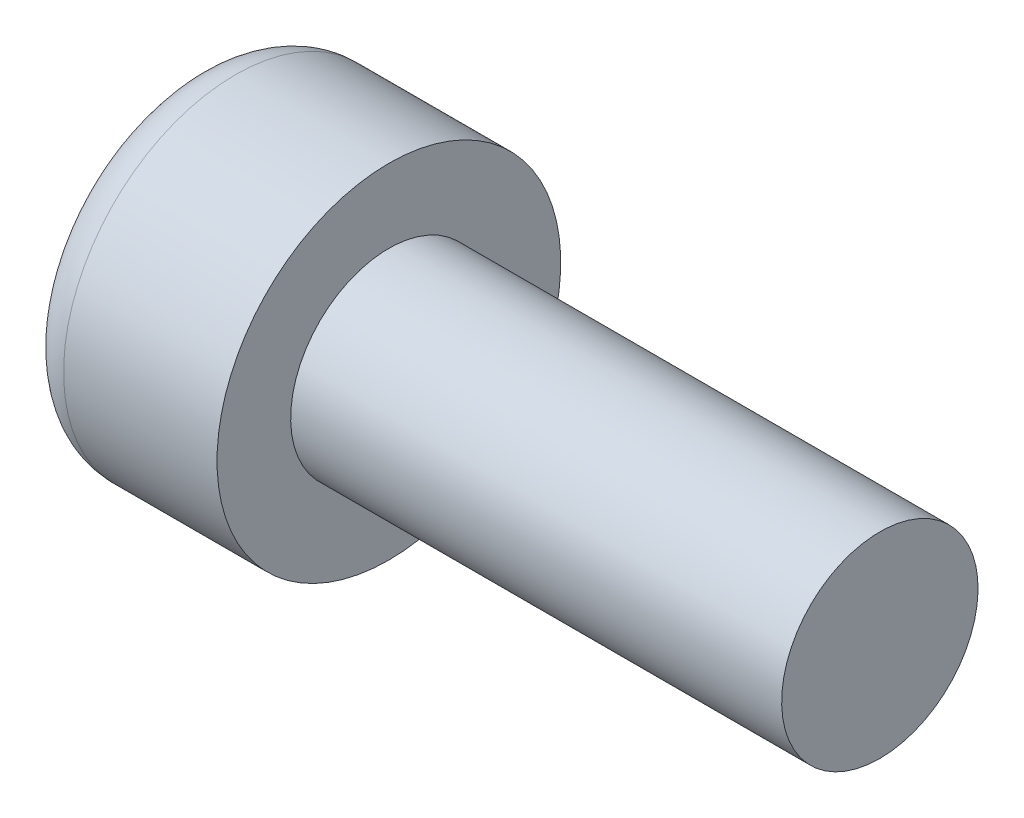
ISO-10303-21;
HEADER;
FILE_DESCRIPTION(('STEP AP214'),'2;1');
FILE_NAME('part.step','',(''),(''),'','','');
FILE_SCHEMA(('AUTOMOTIVE_DESIGN { 1 0 10303 214 1 1 1 1 }'));
ENDSEC;
DATA;
#1=APPLICATION_CONTEXT('core data for automotive mechanical design processes');
#2=APPLICATION_PROTOCOL_DEFINITION('international standard','automotive_design',2000,#1);
#3=PRODUCT_CONTEXT('',#1,'mechanical');
#4=PRODUCT('Part','Part','',(#3));
#5=PRODUCT_RELATED_PRODUCT_CATEGORY('part','',(#4));
#6=PRODUCT_DEFINITION_FORMATION('','',#4);
#7=PRODUCT_DEFINITION_CONTEXT('part definition',#1,'design');
#8=PRODUCT_DEFINITION('design','',#6,#7);
#9=PRODUCT_DEFINITION_SHAPE('','',#8);
#10=(LENGTH_UNIT() NAMED_UNIT(*) SI_UNIT(.MILLI.,.METRE.));
#11=(NAMED_UNIT(*) PLANE_ANGLE_UNIT() SI_UNIT($,.RADIAN.));
#12=(NAMED_UNIT(*) SI_UNIT($,.STERADIAN.) SOLID_ANGLE_UNIT());
#13=UNCERTAINTY_MEASURE_WITH_UNIT(LENGTH_MEASURE(1.E-05),#10,'distance_accuracy_value','');
#14=(GEOMETRIC_REPRESENTATION_CONTEXT(3) GLOBAL_UNCERTAINTY_ASSIGNED_CONTEXT((#13)) GLOBAL_UNIT_ASSIGNED_CONTEXT((#10,
#11,#12)) REPRESENTATION_CONTEXT('',''));
#15=CARTESIAN_POINT('',(0.,0.,0.));
#16=DIRECTION('',(0.,0.,1.));
#17=DIRECTION('',(1.,0.,0.));
#18=AXIS2_PLACEMENT_3D('',#15,#16,#17);
#19=CARTESIAN_POINT('',(0.,0.,0.));
#20=DIRECTION('',(1.,0.,0.));
#21=DIRECTION('',(0.,1.,0.));
#22=AXIS2_PLACEMENT_3D('',#19,#20,#21);
#23=PLANE('',#22);
#24=DIRECTION('',(0.,-0.5,-0.866025403784439));
#25=VECTOR('',#24,1.);
#26=CARTESIAN_POINT('',(0.,1.73205080756888,0.));
#27=LINE('',#26,#25);
#28=CARTESIAN_POINT('',(0.,1.73205080756888,0.));
#29=VERTEX_POINT('',#28);
#30=CARTESIAN_POINT('',(0.,0.866025403784439,-1.5));
#31=VERTEX_POINT('',#30);
#32=EDGE_CURVE('E121',#29,#31,#27,.T.);
#33=ORIENTED_EDGE('',*,*,#32,.F.);
#34=DIRECTION('',(0.,0.5,-0.866025403784439));
#35=VECTOR('',#34,1.);
#36=CARTESIAN_POINT('',(0.,0.866025403784439,1.5));
#37=LINE('',#36,#35);
#38=CARTESIAN_POINT('',(0.,0.866025403784439,1.5));
#39=VERTEX_POINT('',#38);
#40=EDGE_CURVE('E47',#39,#29,#37,.T.);
#41=ORIENTED_EDGE('',*,*,#40,.F.);
#42=DIRECTION('',(0.,1.,0.));
#43=VECTOR('',#42,1.);
#44=CARTESIAN_POINT('',(0.,-0.866025403784439,1.5));
#45=LINE('',#44,#43);
#46=CARTESIAN_POINT('',(0.,-0.866025403784439,1.5));
#47=VERTEX_POINT('',#46);
#48=EDGE_CURVE('E130',#47,#39,#45,.T.);
#49=ORIENTED_EDGE('',*,*,#48,.F.);
#50=DIRECTION('',(0.,0.5,0.866025403784439));
#51=VECTOR('',#50,1.);
#52=CARTESIAN_POINT('',(0.,-1.73205080756888,0.));
#53=LINE('',#52,#51);
#54=CARTESIAN_POINT('',(0.,-1.73205080756888,0.));
#55=VERTEX_POINT('',#54);
#56=EDGE_CURVE('E128',#55,#47,#53,.T.);
#57=ORIENTED_EDGE('',*,*,#56,.F.);
#58=DIRECTION('',(0.,-0.5,0.866025403784439));
#59=VECTOR('',#58,1.);
#60=CARTESIAN_POINT('',(0.,-0.866025403784439,-1.5));
#61=LINE('',#60,#59);
#62=CARTESIAN_POINT('',(0.,-0.866025403784439,-1.5));
#63=VERTEX_POINT('',#62);
#64=EDGE_CURVE('E95',#63,#55,#61,.T.);
#65=ORIENTED_EDGE('',*,*,#64,.F.);
#66=DIRECTION('',(0.,-1.,0.));
#67=VECTOR('',#66,1.);
#68=CARTESIAN_POINT('',(0.,0.866025403784439,-1.5));
#69=LINE('',#68,#67);
#70=EDGE_CURVE('E124',#31,#63,#69,.T.);
#71=ORIENTED_EDGE('',*,*,#70,.F.);
#72=EDGE_LOOP('',(#33,#41,#49,#57,#65,#71));
#73=FACE_BOUND('',#72,.T.);
#74=CARTESIAN_POINT('',(0.,0.,0.));
#75=DIRECTION('',(-1.,0.,0.));
#76=DIRECTION('',(0.,-1.,0.));
#77=AXIS2_PLACEMENT_3D('',#74,#75,#76);
#78=CIRCLE('',#77,2.625);
#79=CARTESIAN_POINT('',(0.,-2.625,0.));
#80=VERTEX_POINT('',#79);
#81=EDGE_CURVE('E11',#80,#80,#78,.T.);
#82=ORIENTED_EDGE('',*,*,#81,.T.);
#83=EDGE_LOOP('',(#82));
#84=FACE_BOUND('',#83,.T.);
#85=ADVANCED_FACE('F33',(#73,#84),#23,.F.);
#86=CARTESIAN_POINT('',(0.875,0.,0.));
#87=DIRECTION('',(-1.,0.,0.));
#88=DIRECTION('',(0.,-1.,0.));
#89=AXIS2_PLACEMENT_3D('',#86,#87,#88);
#90=TOROIDAL_SURFACE('',#89,2.625,0.875);
#91=ORIENTED_EDGE('',*,*,#81,.F.);
#92=EDGE_LOOP('',(#91));
#93=FACE_BOUND('',#92,.T.);
#94=CARTESIAN_POINT('',(0.875,0.,0.));
#95=DIRECTION('',(-1.,0.,0.));
#96=DIRECTION('',(0.,-1.,0.));
#97=AXIS2_PLACEMENT_3D('',#94,#95,#96);
#98=CIRCLE('',#97,3.5);
#99=CARTESIAN_POINT('',(0.875000000000001,-3.5,0.));
#100=VERTEX_POINT('',#99);
#101=EDGE_CURVE('E40',#100,#100,#98,.T.);
#102=ORIENTED_EDGE('',*,*,#101,.T.);
#103=EDGE_LOOP('',(#102));
#104=FACE_BOUND('',#103,.T.);
#105=ADVANCED_FACE('F150',(#93,#104),#90,.T.);
#106=CARTESIAN_POINT('',(0.,0.,0.));
#107=DIRECTION('',(-1.,0.,0.));
#108=DIRECTION('',(0.,-1.,0.));
#109=AXIS2_PLACEMENT_3D('',#106,#107,#108);
#110=CYLINDRICAL_SURFACE('',#109,3.5);
#111=ORIENTED_EDGE('',*,*,#101,.F.);
#112=EDGE_LOOP('',(#111));
#113=FACE_BOUND('',#112,.T.);
#114=CARTESIAN_POINT('',(4.,0.,0.));
#115=DIRECTION('',(-1.,0.,0.));
#116=DIRECTION('',(0.,-1.,0.));
#117=AXIS2_PLACEMENT_3D('',#114,#115,#116);
#118=CIRCLE('',#117,3.5);
#119=CARTESIAN_POINT('',(4.,-3.5,0.));
#120=VERTEX_POINT('',#119);
#121=EDGE_CURVE('E145',#120,#120,#118,.T.);
#122=ORIENTED_EDGE('',*,*,#121,.T.);
#123=EDGE_LOOP('',(#122));
#124=FACE_BOUND('',#123,.T.);
#125=ADVANCED_FACE('F152',(#113,#124),#110,.T.);
#126=CARTESIAN_POINT('',(4.,3.5,0.));
#127=DIRECTION('',(-1.,0.,0.));
#128=DIRECTION('',(0.,-1.,0.));
#129=AXIS2_PLACEMENT_3D('',#126,#127,#128);
#130=PLANE('',#129);
#131=ORIENTED_EDGE('',*,*,#121,.F.);
#132=EDGE_LOOP('',(#131));
#133=FACE_BOUND('',#132,.T.);
#134=CARTESIAN_POINT('',(4.,0.,0.));
#135=DIRECTION('',(-1.,0.,0.));
#136=DIRECTION('',(0.,-1.,0.));
#137=AXIS2_PLACEMENT_3D('',#134,#135,#136);
#138=CIRCLE('',#137,2.);
#139=CARTESIAN_POINT('',(4.,-2.,0.));
#140=VERTEX_POINT('',#139);
#141=EDGE_CURVE('E142',#140,#140,#138,.T.);
#142=ORIENTED_EDGE('',*,*,#141,.T.);
#143=EDGE_LOOP('',(#142));
#144=FACE_BOUND('',#143,.T.);
#145=ADVANCED_FACE('F155',(#133,#144),#130,.F.);
#146=CARTESIAN_POINT('',(0.,0.,0.));
#147=DIRECTION('',(-1.,0.,0.));
#148=DIRECTION('',(0.,-1.,0.));
#149=AXIS2_PLACEMENT_3D('',#146,#147,#148);
#150=CYLINDRICAL_SURFACE('',#149,2.);
#151=ORIENTED_EDGE('',*,*,#141,.F.);
#152=EDGE_LOOP('',(#151));
#153=FACE_BOUND('',#152,.T.);
#154=CARTESIAN_POINT('',(14.,0.,0.));
#155=DIRECTION('',(-1.,0.,0.));
#156=DIRECTION('',(0.,-1.,0.));
#157=AXIS2_PLACEMENT_3D('',#154,#155,#156);
#158=CIRCLE('',#157,2.);
#159=CARTESIAN_POINT('',(14.,-1.99999999999999,0.));
#160=VERTEX_POINT('',#159);
#161=EDGE_CURVE('E134',#160,#160,#158,.T.);
#162=ORIENTED_EDGE('',*,*,#161,.T.);
#163=EDGE_LOOP('',(#162));
#164=FACE_BOUND('',#163,.T.);
#165=ADVANCED_FACE('F161',(#153,#164),#150,.T.);
#166=CARTESIAN_POINT('',(14.,2.,0.));
#167=DIRECTION('',(-1.,0.,0.));
#168=DIRECTION('',(0.,-1.,0.));
#169=AXIS2_PLACEMENT_3D('',#166,#167,#168);
#170=PLANE('',#169);
#171=ORIENTED_EDGE('',*,*,#161,.F.);
#172=EDGE_LOOP('',(#171));
#173=FACE_BOUND('',#172,.T.);
#174=ADVANCED_FACE('F167',(#173),#170,.F.);
#175=CARTESIAN_POINT('',(2.,0.866025403784439,1.5));
#176=DIRECTION('',(0.,0.866025403784439,0.5));
#177=DIRECTION('',(0.,-0.5,0.866025403784439));
#178=AXIS2_PLACEMENT_3D('',#175,#176,#177);
#179=PLANE('',#178);
#180=ORIENTED_EDGE('',*,*,#40,.T.);
#181=DIRECTION('',(-1.,0.,0.));
#182=VECTOR('',#181,1.);
#183=CARTESIAN_POINT('',(2.,1.73205080756888,0.));
#184=LINE('',#183,#182);
#185=CARTESIAN_POINT('',(2.,1.73205080756888,0.));
#186=VERTEX_POINT('',#185);
#187=EDGE_CURVE('E77',#186,#29,#184,.T.);
#188=ORIENTED_EDGE('',*,*,#187,.F.);
#189=DIRECTION('',(0.,0.5,-0.866025403784439));
#190=VECTOR('',#189,1.);
#191=CARTESIAN_POINT('',(2.,0.866025403784439,1.5));
#192=LINE('',#191,#190);
#193=CARTESIAN_POINT('',(2.,0.866025403784439,1.5));
#194=VERTEX_POINT('',#193);
#195=EDGE_CURVE('E132',#194,#186,#192,.T.);
#196=ORIENTED_EDGE('',*,*,#195,.F.);
#197=DIRECTION('',(-1.,0.,0.));
#198=VECTOR('',#197,1.);
#199=CARTESIAN_POINT('',(2.,0.866025403784439,1.5));
#200=LINE('',#199,#198);
#201=EDGE_CURVE('E55',#194,#39,#200,.T.);
#202=ORIENTED_EDGE('',*,*,#201,.T.);
#203=EDGE_LOOP('',(#180,#188,#196,#202));
#204=FACE_BOUND('',#203,.T.);
#205=ADVANCED_FACE('F172',(#204),#179,.F.);
#206=CARTESIAN_POINT('',(2.,-0.866025403784439,1.5));
#207=DIRECTION('',(0.,0.,1.));
#208=DIRECTION('',(0.,-1.,0.));
#209=AXIS2_PLACEMENT_3D('',#206,#207,#208);
#210=PLANE('',#209);
#211=ORIENTED_EDGE('',*,*,#48,.T.);
#212=ORIENTED_EDGE('',*,*,#201,.F.);
#213=DIRECTION('',(0.,1.,0.));
#214=VECTOR('',#213,1.);
#215=CARTESIAN_POINT('',(2.,-0.866025403784439,1.5));
#216=LINE('',#215,#214);
#217=CARTESIAN_POINT('',(2.,-0.866025403784439,1.5));
#218=VERTEX_POINT('',#217);
#219=EDGE_CURVE('E107',#218,#194,#216,.T.);
#220=ORIENTED_EDGE('',*,*,#219,.F.);
#221=DIRECTION('',(-1.,0.,0.));
#222=VECTOR('',#221,1.);
#223=CARTESIAN_POINT('',(2.,-0.866025403784439,1.5));
#224=LINE('',#223,#222);
#225=EDGE_CURVE('E99',#218,#47,#224,.T.);
#226=ORIENTED_EDGE('',*,*,#225,.T.);
#227=EDGE_LOOP('',(#211,#212,#220,#226));
#228=FACE_BOUND('',#227,.T.);
#229=ADVANCED_FACE('F177',(#228),#210,.F.);
#230=CARTESIAN_POINT('',(2.,-1.73205080756888,0.));
#231=DIRECTION('',(0.,-0.866025403784439,0.5));
#232=DIRECTION('',(0.,-0.5,-0.866025403784439));
#233=AXIS2_PLACEMENT_3D('',#230,#231,#232);
#234=PLANE('',#233);
#235=ORIENTED_EDGE('',*,*,#56,.T.);
#236=ORIENTED_EDGE('',*,*,#225,.F.);
#237=DIRECTION('',(0.,0.5,0.866025403784439));
#238=VECTOR('',#237,1.);
#239=CARTESIAN_POINT('',(2.,-1.73205080756888,0.));
#240=LINE('',#239,#238);
#241=CARTESIAN_POINT('',(2.,-1.73205080756888,0.));
#242=VERTEX_POINT('',#241);
#243=EDGE_CURVE('E103',#242,#218,#240,.T.);
#244=ORIENTED_EDGE('',*,*,#243,.F.);
#245=DIRECTION('',(-1.,0.,0.));
#246=VECTOR('',#245,1.);
#247=CARTESIAN_POINT('',(2.,-1.73205080756888,0.));
#248=LINE('',#247,#246);
#249=EDGE_CURVE('E88',#242,#55,#248,.T.);
#250=ORIENTED_EDGE('',*,*,#249,.T.);
#251=EDGE_LOOP('',(#235,#236,#244,#250));
#252=FACE_BOUND('',#251,.T.);
#253=ADVANCED_FACE('F104',(#252),#234,.F.);
#254=CARTESIAN_POINT('',(2.,-0.866025403784439,-1.5));
#255=DIRECTION('',(0.,-0.866025403784439,-0.5));
#256=DIRECTION('',(0.,0.5,-0.866025403784439));
#257=AXIS2_PLACEMENT_3D('',#254,#255,#256);
#258=PLANE('',#257);
#259=ORIENTED_EDGE('',*,*,#64,.T.);
#260=ORIENTED_EDGE('',*,*,#249,.F.);
#261=DIRECTION('',(0.,-0.5,0.866025403784439));
#262=VECTOR('',#261,1.);
#263=CARTESIAN_POINT('',(2.,-0.866025403784439,-1.5));
#264=LINE('',#263,#262);
#265=CARTESIAN_POINT('',(2.,-0.866025403784439,-1.5));
#266=VERTEX_POINT('',#265);
#267=EDGE_CURVE('E92',#266,#242,#264,.T.);
#268=ORIENTED_EDGE('',*,*,#267,.F.);
#269=DIRECTION('',(-1.,0.,0.));
#270=VECTOR('',#269,1.);
#271=CARTESIAN_POINT('',(2.,-0.866025403784439,-1.5));
#272=LINE('',#271,#270);
#273=EDGE_CURVE('E100',#266,#63,#272,.T.);
#274=ORIENTED_EDGE('',*,*,#273,.T.);
#275=EDGE_LOOP('',(#259,#260,#268,#274));
#276=FACE_BOUND('',#275,.T.);
#277=ADVANCED_FACE('F90',(#276),#258,.F.);
#278=CARTESIAN_POINT('',(2.,0.866025403784439,-1.5));
#279=DIRECTION('',(0.,0.,-1.));
#280=DIRECTION('',(-1.,0.,0.));
#281=AXIS2_PLACEMENT_3D('',#278,#279,#280);
#282=PLANE('',#281);
#283=ORIENTED_EDGE('',*,*,#70,.T.);
#284=ORIENTED_EDGE('',*,*,#273,.F.);
#285=DIRECTION('',(0.,-1.,0.));
#286=VECTOR('',#285,1.);
#287=CARTESIAN_POINT('',(2.,0.866025403784439,-1.5));
#288=LINE('',#287,#286);
#289=CARTESIAN_POINT('',(2.,0.866025403784439,-1.5));
#290=VERTEX_POINT('',#289);
#291=EDGE_CURVE('E113',#290,#266,#288,.T.);
#292=ORIENTED_EDGE('',*,*,#291,.F.);
#293=DIRECTION('',(-1.,0.,0.));
#294=VECTOR('',#293,1.);
#295=CARTESIAN_POINT('',(2.,0.866025403784439,-1.5));
#296=LINE('',#295,#294);
#297=EDGE_CURVE('E137',#290,#31,#296,.T.);
#298=ORIENTED_EDGE('',*,*,#297,.T.);
#299=EDGE_LOOP('',(#283,#284,#292,#298));
#300=FACE_BOUND('',#299,.T.);
#301=ADVANCED_FACE('F203',(#300),#282,.F.);
#302=CARTESIAN_POINT('',(2.,1.73205080756888,0.));
#303=DIRECTION('',(0.,0.866025403784439,-0.5));
#304=DIRECTION('',(0.,0.5,0.866025403784439));
#305=AXIS2_PLACEMENT_3D('',#302,#303,#304);
#306=PLANE('',#305);
#307=ORIENTED_EDGE('',*,*,#32,.T.);
#308=ORIENTED_EDGE('',*,*,#297,.F.);
#309=DIRECTION('',(0.,-0.5,-0.866025403784439));
#310=VECTOR('',#309,1.);
#311=CARTESIAN_POINT('',(2.,1.73205080756888,0.));
#312=LINE('',#311,#310);
#313=EDGE_CURVE('E115',#186,#290,#312,.T.);
#314=ORIENTED_EDGE('',*,*,#313,.F.);
#315=ORIENTED_EDGE('',*,*,#187,.T.);
#316=EDGE_LOOP('',(#307,#308,#314,#315));
#317=FACE_BOUND('',#316,.T.);
#318=ADVANCED_FACE('F191',(#317),#306,.F.);
#319=CARTESIAN_POINT('',(2.,0.,0.));
#320=DIRECTION('',(-1.,0.,0.));
#321=DIRECTION('',(0.,-1.,0.));
#322=AXIS2_PLACEMENT_3D('',#319,#320,#321);
#323=PLANE('',#322);
#324=ORIENTED_EDGE('',*,*,#195,.T.);
#325=ORIENTED_EDGE('',*,*,#313,.T.);
#326=ORIENTED_EDGE('',*,*,#291,.T.);
#327=ORIENTED_EDGE('',*,*,#267,.T.);
#328=ORIENTED_EDGE('',*,*,#243,.T.);
#329=ORIENTED_EDGE('',*,*,#219,.T.);
#330=EDGE_LOOP('',(#324,#325,#326,#327,#328,#329));
#331=FACE_BOUND('',#330,.T.);
#332=ADVANCED_FACE('F110',(#331),#323,.T.);
#333=CLOSED_SHELL('',(#85,#105,#125,#145,#165,#174,#205,#229,#253,#277,#301,#318,#332));
#334=MANIFOLD_SOLID_BREP('B2',#333);
#335=ADVANCED_BREP_SHAPE_REPRESENTATION('',(#18,#334),#14);
#336=SHAPE_DEFINITION_REPRESENTATION(#9,#335);
ENDSEC;
END-ISO-10303-21;
